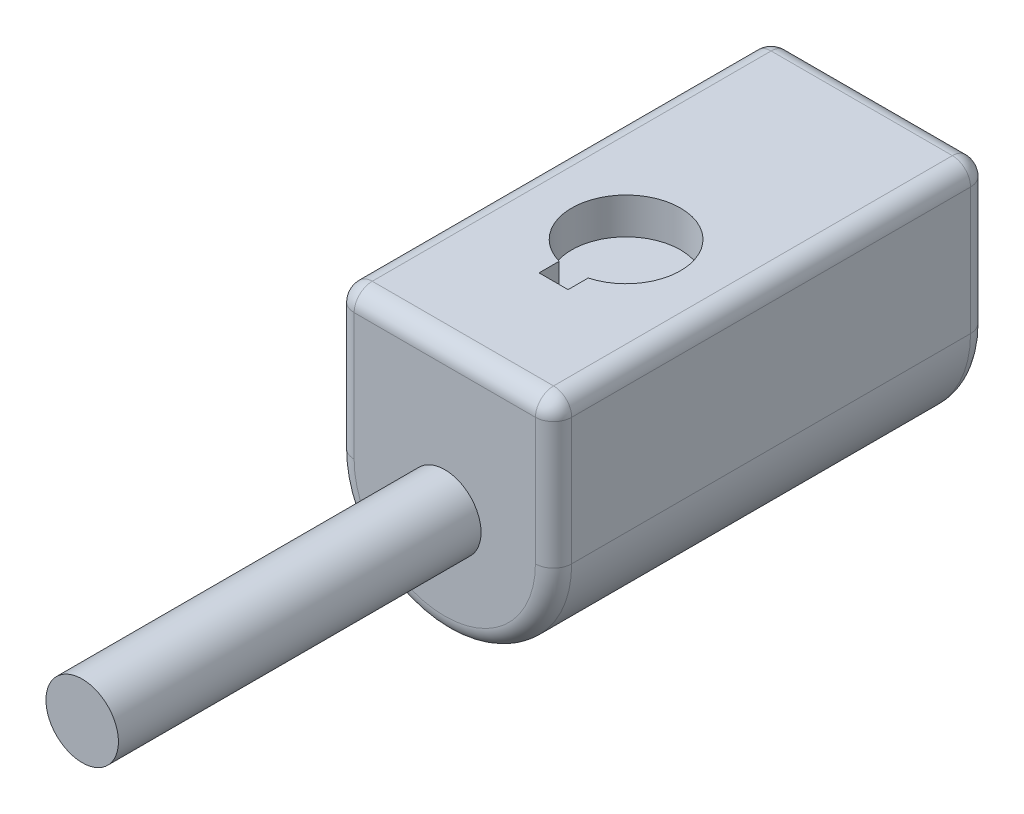
ISO-10303-21;
HEADER;
FILE_DESCRIPTION(('STEP AP214'),'2;1');
FILE_NAME('part.step','',(''),(''),'','','');
FILE_SCHEMA(('AUTOMOTIVE_DESIGN { 1 0 10303 214 1 1 1 1 }'));
ENDSEC;
DATA;
#1=APPLICATION_CONTEXT('core data for automotive mechanical design processes');
#2=APPLICATION_PROTOCOL_DEFINITION('international standard','automotive_design',2000,#1);
#3=PRODUCT_CONTEXT('',#1,'mechanical');
#4=PRODUCT('Part','Part','',(#3));
#5=PRODUCT_RELATED_PRODUCT_CATEGORY('part','',(#4));
#6=PRODUCT_DEFINITION_FORMATION('','',#4);
#7=PRODUCT_DEFINITION_CONTEXT('part definition',#1,'design');
#8=PRODUCT_DEFINITION('design','',#6,#7);
#9=PRODUCT_DEFINITION_SHAPE('','',#8);
#10=(LENGTH_UNIT() NAMED_UNIT(*) SI_UNIT(.MILLI.,.METRE.));
#11=(NAMED_UNIT(*) PLANE_ANGLE_UNIT() SI_UNIT($,.RADIAN.));
#12=(NAMED_UNIT(*) SI_UNIT($,.STERADIAN.) SOLID_ANGLE_UNIT());
#13=UNCERTAINTY_MEASURE_WITH_UNIT(LENGTH_MEASURE(1.E-05),#10,'distance_accuracy_value','');
#14=(GEOMETRIC_REPRESENTATION_CONTEXT(3) GLOBAL_UNCERTAINTY_ASSIGNED_CONTEXT((#13)) GLOBAL_UNIT_ASSIGNED_CONTEXT((#10,
#11,#12)) REPRESENTATION_CONTEXT('',''));
#15=CARTESIAN_POINT('',(0.,0.,0.));
#16=DIRECTION('',(0.,0.,1.));
#17=DIRECTION('',(1.,0.,0.));
#18=AXIS2_PLACEMENT_3D('',#15,#16,#17);
#19=CARTESIAN_POINT('',(0.,0.,0.));
#20=DIRECTION('',(0.,0.,1.));
#21=DIRECTION('',(1.,0.,0.));
#22=AXIS2_PLACEMENT_3D('',#19,#20,#21);
#23=PLANE('',#22);
#24=DIRECTION('',(-1.,0.,0.));
#25=VECTOR('',#24,1.);
#26=CARTESIAN_POINT('',(0.,44.45,0.));
#27=LINE('',#26,#25);
#28=CARTESIAN_POINT('',(31.75,44.45,0.));
#29=VERTEX_POINT('',#28);
#30=CARTESIAN_POINT('',(-31.75,44.45,0.));
#31=VERTEX_POINT('',#30);
#32=EDGE_CURVE('E191',#29,#31,#27,.T.);
#33=ORIENTED_EDGE('',*,*,#32,.T.);
#34=DIRECTION('',(0.,-1.,0.));
#35=VECTOR('',#34,1.);
#36=CARTESIAN_POINT('',(-31.75,0.,0.));
#37=LINE('',#36,#35);
#38=CARTESIAN_POINT('',(-31.75,0.,0.));
#39=VERTEX_POINT('',#38);
#40=EDGE_CURVE('E195',#31,#39,#37,.T.);
#41=ORIENTED_EDGE('',*,*,#40,.T.);
#42=CARTESIAN_POINT('',(0.,0.,0.));
#43=DIRECTION('',(0.,0.,1.));
#44=DIRECTION('',(1.,0.,0.));
#45=AXIS2_PLACEMENT_3D('',#42,#43,#44);
#46=CIRCLE('',#45,31.75);
#47=CARTESIAN_POINT('',(31.75,0.,0.));
#48=VERTEX_POINT('',#47);
#49=EDGE_CURVE('E193',#39,#48,#46,.T.);
#50=ORIENTED_EDGE('',*,*,#49,.T.);
#51=DIRECTION('',(0.,1.,0.));
#52=VECTOR('',#51,1.);
#53=CARTESIAN_POINT('',(31.75,0.,0.));
#54=LINE('',#53,#52);
#55=EDGE_CURVE('E187',#48,#29,#54,.T.);
#56=ORIENTED_EDGE('',*,*,#55,.T.);
#57=EDGE_LOOP('',(#33,#41,#50,#56));
#58=FACE_BOUND('',#57,.T.);
#59=CARTESIAN_POINT('',(0.,0.,0.));
#60=DIRECTION('',(0.,0.,1.));
#61=DIRECTION('',(1.,0.,0.));
#62=AXIS2_PLACEMENT_3D('',#59,#60,#61);
#63=CIRCLE('',#62,12.7);
#64=CARTESIAN_POINT('',(12.7,0.,0.));
#65=VERTEX_POINT('',#64);
#66=EDGE_CURVE('E174',#65,#65,#63,.T.);
#67=ORIENTED_EDGE('',*,*,#66,.F.);
#68=EDGE_LOOP('',(#67));
#69=FACE_BOUND('',#68,.T.);
#70=ADVANCED_FACE('F34',(#58,#69),#23,.T.);
#71=CARTESIAN_POINT('',(0.,0.,-152.4));
#72=DIRECTION('',(0.,0.,1.));
#73=DIRECTION('',(1.,0.,0.));
#74=AXIS2_PLACEMENT_3D('',#71,#72,#73);
#75=CYLINDRICAL_SURFACE('',#74,38.1);
#76=DIRECTION('',(0.,0.,1.));
#77=VECTOR('',#76,1.);
#78=CARTESIAN_POINT('',(38.1,0.,-152.4));
#79=LINE('',#78,#77);
#80=CARTESIAN_POINT('',(38.1,0.,-146.05));
#81=VERTEX_POINT('',#80);
#82=CARTESIAN_POINT('',(38.1,0.,-6.35000000000005));
#83=VERTEX_POINT('',#82);
#84=EDGE_CURVE('E181',#81,#83,#79,.T.);
#85=ORIENTED_EDGE('',*,*,#84,.T.);
#86=CARTESIAN_POINT('',(0.,0.,-6.34999999999999));
#87=DIRECTION('',(0.,0.,1.));
#88=DIRECTION('',(1.,0.,0.));
#89=AXIS2_PLACEMENT_3D('',#86,#87,#88);
#90=CIRCLE('',#89,38.1);
#91=CARTESIAN_POINT('',(-38.1,0.,-6.35000000000005));
#92=VERTEX_POINT('',#91);
#93=EDGE_CURVE('E207',#83,#92,#90,.F.);
#94=ORIENTED_EDGE('',*,*,#93,.T.);
#95=DIRECTION('',(0.,0.,1.));
#96=VECTOR('',#95,1.);
#97=CARTESIAN_POINT('',(-38.1,0.,-152.4));
#98=LINE('',#97,#96);
#99=CARTESIAN_POINT('',(-38.1,0.,-146.05));
#100=VERTEX_POINT('',#99);
#101=EDGE_CURVE('E184',#100,#92,#98,.T.);
#102=ORIENTED_EDGE('',*,*,#101,.F.);
#103=CARTESIAN_POINT('',(0.,0.,-146.05));
#104=DIRECTION('',(0.,0.,1.));
#105=DIRECTION('',(1.,0.,0.));
#106=AXIS2_PLACEMENT_3D('',#103,#104,#105);
#107=CIRCLE('',#106,38.1);
#108=EDGE_CURVE('E205',#100,#81,#107,.T.);
#109=ORIENTED_EDGE('',*,*,#108,.T.);
#110=EDGE_LOOP('',(#85,#94,#102,#109));
#111=FACE_BOUND('',#110,.T.);
#112=ADVANCED_FACE('F298',(#111),#75,.T.);
#113=CARTESIAN_POINT('',(-38.1,0.,-152.4));
#114=DIRECTION('',(-1.,0.,0.));
#115=DIRECTION('',(0.,0.,1.));
#116=AXIS2_PLACEMENT_3D('',#113,#114,#115);
#117=PLANE('',#116);
#118=ORIENTED_EDGE('',*,*,#101,.T.);
#119=DIRECTION('',(0.,-1.,0.));
#120=VECTOR('',#119,1.);
#121=CARTESIAN_POINT('',(-38.1,0.,-6.34999999999999));
#122=LINE('',#121,#120);
#123=CARTESIAN_POINT('',(-38.1,44.45,-6.35));
#124=VERTEX_POINT('',#123);
#125=EDGE_CURVE('E202',#92,#124,#122,.F.);
#126=ORIENTED_EDGE('',*,*,#125,.T.);
#127=DIRECTION('',(0.,0.,1.));
#128=VECTOR('',#127,1.);
#129=CARTESIAN_POINT('',(-38.1,44.45,-152.4));
#130=LINE('',#129,#128);
#131=CARTESIAN_POINT('',(-38.1,44.45,-146.05));
#132=VERTEX_POINT('',#131);
#133=EDGE_CURVE('E198',#124,#132,#130,.F.);
#134=ORIENTED_EDGE('',*,*,#133,.T.);
#135=DIRECTION('',(0.,-1.,0.));
#136=VECTOR('',#135,1.);
#137=CARTESIAN_POINT('',(-38.1,0.,-146.05));
#138=LINE('',#137,#136);
#139=EDGE_CURVE('E200',#132,#100,#138,.T.);
#140=ORIENTED_EDGE('',*,*,#139,.T.);
#141=EDGE_LOOP('',(#118,#126,#134,#140));
#142=FACE_BOUND('',#141,.T.);
#143=ADVANCED_FACE('F302',(#142),#117,.T.);
#144=CARTESIAN_POINT('',(-38.1,50.8,-152.4));
#145=DIRECTION('',(0.,1.,0.));
#146=DIRECTION('',(0.,0.,1.));
#147=AXIS2_PLACEMENT_3D('',#144,#145,#146);
#148=PLANE('',#147);
#149=DIRECTION('',(-1.,0.,0.));
#150=VECTOR('',#149,1.);
#151=CARTESIAN_POINT('',(-38.1,50.8,-146.05));
#152=LINE('',#151,#150);
#153=CARTESIAN_POINT('',(31.75,50.8,-146.05));
#154=VERTEX_POINT('',#153);
#155=CARTESIAN_POINT('',(-31.75,50.8,-146.05));
#156=VERTEX_POINT('',#155);
#157=EDGE_CURVE('E222',#154,#156,#152,.T.);
#158=ORIENTED_EDGE('',*,*,#157,.T.);
#159=DIRECTION('',(0.,0.,1.));
#160=VECTOR('',#159,1.);
#161=CARTESIAN_POINT('',(-31.75,50.8,-152.4));
#162=LINE('',#161,#160);
#163=CARTESIAN_POINT('',(-31.75,50.8,-6.35));
#164=VERTEX_POINT('',#163);
#165=EDGE_CURVE('E224',#156,#164,#162,.T.);
#166=ORIENTED_EDGE('',*,*,#165,.T.);
#167=DIRECTION('',(-1.,0.,0.));
#168=VECTOR('',#167,1.);
#169=CARTESIAN_POINT('',(-38.1,50.8,-6.34999999999999));
#170=LINE('',#169,#168);
#171=CARTESIAN_POINT('',(31.75,50.8,-6.35));
#172=VERTEX_POINT('',#171);
#173=EDGE_CURVE('E218',#164,#172,#170,.F.);
#174=ORIENTED_EDGE('',*,*,#173,.T.);
#175=DIRECTION('',(0.,0.,1.));
#176=VECTOR('',#175,1.);
#177=CARTESIAN_POINT('',(31.75,50.8,-152.4));
#178=LINE('',#177,#176);
#179=EDGE_CURVE('E220',#172,#154,#178,.F.);
#180=ORIENTED_EDGE('',*,*,#179,.T.);
#181=EDGE_LOOP('',(#158,#166,#174,#180));
#182=FACE_BOUND('',#181,.T.);
#183=DIRECTION('',(0.,0.,1.));
#184=VECTOR('',#183,1.);
#185=CARTESIAN_POINT('',(-5.08000000000001,50.8,-45.1398229856028));
#186=LINE('',#185,#184);
#187=CARTESIAN_POINT('',(-5.08,50.8,-45.1398229856028));
#188=VERTEX_POINT('',#187);
#189=CARTESIAN_POINT('',(-5.08000000000001,50.8,-38.1));
#190=VERTEX_POINT('',#189);
#191=EDGE_CURVE('E142',#188,#190,#186,.T.);
#192=ORIENTED_EDGE('',*,*,#191,.F.);
#193=CARTESIAN_POINT('',(0.,50.8,-63.5));
#194=DIRECTION('',(0.,1.,0.));
#195=DIRECTION('',(0.,0.,1.));
#196=AXIS2_PLACEMENT_3D('',#193,#194,#195);
#197=CIRCLE('',#196,19.05);
#198=CARTESIAN_POINT('',(5.07999999999999,50.8,-45.1398229856028));
#199=VERTEX_POINT('',#198);
#200=EDGE_CURVE('E159',#199,#188,#197,.T.);
#201=ORIENTED_EDGE('',*,*,#200,.F.);
#202=DIRECTION('',(0.,0.,-1.));
#203=VECTOR('',#202,1.);
#204=CARTESIAN_POINT('',(5.07999999999999,50.8,-45.1398229856028));
#205=LINE('',#204,#203);
#206=CARTESIAN_POINT('',(5.08,50.8,-38.1));
#207=VERTEX_POINT('',#206);
#208=EDGE_CURVE('E162',#207,#199,#205,.T.);
#209=ORIENTED_EDGE('',*,*,#208,.F.);
#210=DIRECTION('',(1.,0.,0.));
#211=VECTOR('',#210,1.);
#212=CARTESIAN_POINT('',(5.08,50.8,-38.1));
#213=LINE('',#212,#211);
#214=EDGE_CURVE('E168',#190,#207,#213,.T.);
#215=ORIENTED_EDGE('',*,*,#214,.F.);
#216=EDGE_LOOP('',(#192,#201,#209,#215));
#217=FACE_BOUND('',#216,.T.);
#218=ADVANCED_FACE('F348',(#182,#217),#148,.T.);
#219=CARTESIAN_POINT('',(38.1,0.,-152.4));
#220=DIRECTION('',(1.,0.,0.));
#221=DIRECTION('',(0.,0.,-1.));
#222=AXIS2_PLACEMENT_3D('',#219,#220,#221);
#223=PLANE('',#222);
#224=DIRECTION('',(0.,0.,1.));
#225=VECTOR('',#224,1.);
#226=CARTESIAN_POINT('',(38.1,44.45,-152.4));
#227=LINE('',#226,#225);
#228=CARTESIAN_POINT('',(38.1,44.45,-146.05));
#229=VERTEX_POINT('',#228);
#230=CARTESIAN_POINT('',(38.1,44.45,-6.35));
#231=VERTEX_POINT('',#230);
#232=EDGE_CURVE('E43',#229,#231,#227,.T.);
#233=ORIENTED_EDGE('',*,*,#232,.T.);
#234=DIRECTION('',(0.,1.,0.));
#235=VECTOR('',#234,1.);
#236=CARTESIAN_POINT('',(38.1,0.,-6.34999999999999));
#237=LINE('',#236,#235);
#238=EDGE_CURVE('E11',#231,#83,#237,.F.);
#239=ORIENTED_EDGE('',*,*,#238,.T.);
#240=ORIENTED_EDGE('',*,*,#84,.F.);
#241=DIRECTION('',(0.,1.,0.));
#242=VECTOR('',#241,1.);
#243=CARTESIAN_POINT('',(38.1,50.8,-146.05));
#244=LINE('',#243,#242);
#245=EDGE_CURVE('E54',#81,#229,#244,.T.);
#246=ORIENTED_EDGE('',*,*,#245,.T.);
#247=EDGE_LOOP('',(#233,#239,#240,#246));
#248=FACE_BOUND('',#247,.T.);
#249=ADVANCED_FACE('F296',(#248),#223,.T.);
#250=CARTESIAN_POINT('',(0.,0.,-152.4));
#251=DIRECTION('',(0.,0.,1.));
#252=DIRECTION('',(1.,0.,0.));
#253=AXIS2_PLACEMENT_3D('',#250,#251,#252);
#254=PLANE('',#253);
#255=CARTESIAN_POINT('',(0.,0.,-152.4));
#256=DIRECTION('',(0.,0.,1.));
#257=DIRECTION('',(1.,0.,0.));
#258=AXIS2_PLACEMENT_3D('',#255,#256,#257);
#259=CIRCLE('',#258,31.75);
#260=CARTESIAN_POINT('',(31.75,0.,-152.4));
#261=VERTEX_POINT('',#260);
#262=CARTESIAN_POINT('',(-31.75,0.,-152.4));
#263=VERTEX_POINT('',#262);
#264=EDGE_CURVE('E213',#261,#263,#259,.F.);
#265=ORIENTED_EDGE('',*,*,#264,.T.);
#266=DIRECTION('',(0.,-1.,0.));
#267=VECTOR('',#266,1.);
#268=CARTESIAN_POINT('',(-31.75,50.8,-152.4));
#269=LINE('',#268,#267);
#270=CARTESIAN_POINT('',(-31.75,44.45,-152.4));
#271=VERTEX_POINT('',#270);
#272=EDGE_CURVE('E215',#263,#271,#269,.F.);
#273=ORIENTED_EDGE('',*,*,#272,.T.);
#274=DIRECTION('',(-1.,0.,0.));
#275=VECTOR('',#274,1.);
#276=CARTESIAN_POINT('',(38.1,44.45,-152.4));
#277=LINE('',#276,#275);
#278=CARTESIAN_POINT('',(31.75,44.45,-152.4));
#279=VERTEX_POINT('',#278);
#280=EDGE_CURVE('E211',#271,#279,#277,.F.);
#281=ORIENTED_EDGE('',*,*,#280,.T.);
#282=DIRECTION('',(0.,1.,0.));
#283=VECTOR('',#282,1.);
#284=CARTESIAN_POINT('',(31.75,0.,-152.4));
#285=LINE('',#284,#283);
#286=EDGE_CURVE('E209',#279,#261,#285,.F.);
#287=ORIENTED_EDGE('',*,*,#286,.T.);
#288=EDGE_LOOP('',(#265,#273,#281,#287));
#289=FACE_BOUND('',#288,.T.);
#290=ADVANCED_FACE('F337',(#289),#254,.F.);
#291=CARTESIAN_POINT('',(0.,0.,127.));
#292=DIRECTION('',(0.,0.,-1.));
#293=DIRECTION('',(-1.,0.,0.));
#294=AXIS2_PLACEMENT_3D('',#291,#292,#293);
#295=CYLINDRICAL_SURFACE('',#294,12.7);
#296=CARTESIAN_POINT('',(0.,0.,127.));
#297=DIRECTION('',(0.,0.,1.));
#298=DIRECTION('',(1.,0.,0.));
#299=AXIS2_PLACEMENT_3D('',#296,#297,#298);
#300=CIRCLE('',#299,12.7);
#301=CARTESIAN_POINT('',(12.7,0.,127.));
#302=VERTEX_POINT('',#301);
#303=EDGE_CURVE('E178',#302,#302,#300,.T.);
#304=ORIENTED_EDGE('',*,*,#303,.F.);
#305=EDGE_LOOP('',(#304));
#306=FACE_BOUND('',#305,.T.);
#307=ORIENTED_EDGE('',*,*,#66,.T.);
#308=EDGE_LOOP('',(#307));
#309=FACE_BOUND('',#308,.T.);
#310=ADVANCED_FACE('F339',(#306,#309),#295,.T.);
#311=CARTESIAN_POINT('',(0.,0.,127.));
#312=DIRECTION('',(0.,0.,1.));
#313=DIRECTION('',(1.,0.,0.));
#314=AXIS2_PLACEMENT_3D('',#311,#312,#313);
#315=PLANE('',#314);
#316=ORIENTED_EDGE('',*,*,#303,.T.);
#317=EDGE_LOOP('',(#316));
#318=FACE_BOUND('',#317,.T.);
#319=ADVANCED_FACE('F345',(#318),#315,.T.);
#320=CARTESIAN_POINT('',(-5.08000000000001,38.1,-45.1398229856028));
#321=DIRECTION('',(-1.,0.,0.));
#322=DIRECTION('',(0.,0.,1.));
#323=AXIS2_PLACEMENT_3D('',#320,#321,#322);
#324=PLANE('',#323);
#325=ORIENTED_EDGE('',*,*,#191,.T.);
#326=DIRECTION('',(0.,1.,0.));
#327=VECTOR('',#326,1.);
#328=CARTESIAN_POINT('',(-5.08000000000001,38.1,-38.1));
#329=LINE('',#328,#327);
#330=CARTESIAN_POINT('',(-5.08000000000001,38.1,-38.1));
#331=VERTEX_POINT('',#330);
#332=EDGE_CURVE('E135',#331,#190,#329,.T.);
#333=ORIENTED_EDGE('',*,*,#332,.F.);
#334=DIRECTION('',(0.,0.,1.));
#335=VECTOR('',#334,1.);
#336=CARTESIAN_POINT('',(-5.08000000000001,38.1,-45.1398229856028));
#337=LINE('',#336,#335);
#338=CARTESIAN_POINT('',(-5.08,38.1,-45.1398229856028));
#339=VERTEX_POINT('',#338);
#340=EDGE_CURVE('E139',#339,#331,#337,.T.);
#341=ORIENTED_EDGE('',*,*,#340,.F.);
#342=DIRECTION('',(0.,1.,0.));
#343=VECTOR('',#342,1.);
#344=CARTESIAN_POINT('',(-5.08,38.1,-45.1398229856028));
#345=LINE('',#344,#343);
#346=EDGE_CURVE('E172',#339,#188,#345,.T.);
#347=ORIENTED_EDGE('',*,*,#346,.T.);
#348=EDGE_LOOP('',(#325,#333,#341,#347));
#349=FACE_BOUND('',#348,.T.);
#350=ADVANCED_FACE('F137',(#349),#324,.F.);
#351=CARTESIAN_POINT('',(0.,38.1,-63.5));
#352=DIRECTION('',(0.,1.,0.));
#353=DIRECTION('',(0.,0.,1.));
#354=AXIS2_PLACEMENT_3D('',#351,#352,#353);
#355=CYLINDRICAL_SURFACE('',#354,19.05);
#356=ORIENTED_EDGE('',*,*,#200,.T.);
#357=ORIENTED_EDGE('',*,*,#346,.F.);
#358=CARTESIAN_POINT('',(0.,38.1,-63.5));
#359=DIRECTION('',(0.,1.,0.));
#360=DIRECTION('',(0.,0.,1.));
#361=AXIS2_PLACEMENT_3D('',#358,#359,#360);
#362=CIRCLE('',#361,19.05);
#363=CARTESIAN_POINT('',(5.07999999999999,38.1,-45.1398229856028));
#364=VERTEX_POINT('',#363);
#365=EDGE_CURVE('E147',#364,#339,#362,.T.);
#366=ORIENTED_EDGE('',*,*,#365,.F.);
#367=DIRECTION('',(0.,1.,0.));
#368=VECTOR('',#367,1.);
#369=CARTESIAN_POINT('',(5.07999999999999,38.1,-45.1398229856028));
#370=LINE('',#369,#368);
#371=EDGE_CURVE('E175',#364,#199,#370,.T.);
#372=ORIENTED_EDGE('',*,*,#371,.T.);
#373=EDGE_LOOP('',(#356,#357,#366,#372));
#374=FACE_BOUND('',#373,.T.);
#375=ADVANCED_FACE('F399',(#374),#355,.F.);
#376=CARTESIAN_POINT('',(5.07999999999999,38.1,-45.1398229856028));
#377=DIRECTION('',(1.,0.,0.));
#378=DIRECTION('',(0.,0.,-1.));
#379=AXIS2_PLACEMENT_3D('',#376,#377,#378);
#380=PLANE('',#379);
#381=ORIENTED_EDGE('',*,*,#208,.T.);
#382=ORIENTED_EDGE('',*,*,#371,.F.);
#383=DIRECTION('',(0.,0.,-1.));
#384=VECTOR('',#383,1.);
#385=CARTESIAN_POINT('',(5.07999999999999,38.1,-45.1398229856028));
#386=LINE('',#385,#384);
#387=CARTESIAN_POINT('',(5.08,38.1,-38.1));
#388=VERTEX_POINT('',#387);
#389=EDGE_CURVE('E155',#388,#364,#386,.T.);
#390=ORIENTED_EDGE('',*,*,#389,.F.);
#391=DIRECTION('',(0.,1.,0.));
#392=VECTOR('',#391,1.);
#393=CARTESIAN_POINT('',(5.08,38.1,-38.1));
#394=LINE('',#393,#392);
#395=EDGE_CURVE('E146',#388,#207,#394,.T.);
#396=ORIENTED_EDGE('',*,*,#395,.T.);
#397=EDGE_LOOP('',(#381,#382,#390,#396));
#398=FACE_BOUND('',#397,.T.);
#399=ADVANCED_FACE('F396',(#398),#380,.F.);
#400=CARTESIAN_POINT('',(5.08,38.1,-38.1));
#401=DIRECTION('',(0.,0.,1.));
#402=DIRECTION('',(1.,0.,0.));
#403=AXIS2_PLACEMENT_3D('',#400,#401,#402);
#404=PLANE('',#403);
#405=ORIENTED_EDGE('',*,*,#214,.T.);
#406=ORIENTED_EDGE('',*,*,#395,.F.);
#407=DIRECTION('',(1.,0.,0.));
#408=VECTOR('',#407,1.);
#409=CARTESIAN_POINT('',(5.08,38.1,-38.1));
#410=LINE('',#409,#408);
#411=EDGE_CURVE('E150',#331,#388,#410,.T.);
#412=ORIENTED_EDGE('',*,*,#411,.F.);
#413=ORIENTED_EDGE('',*,*,#332,.T.);
#414=EDGE_LOOP('',(#405,#406,#412,#413));
#415=FACE_BOUND('',#414,.T.);
#416=ADVANCED_FACE('F151',(#415),#404,.F.);
#417=CARTESIAN_POINT('',(0.,38.1,-63.5));
#418=DIRECTION('',(0.,1.,0.));
#419=DIRECTION('',(0.,0.,1.));
#420=AXIS2_PLACEMENT_3D('',#417,#418,#419);
#421=PLANE('',#420);
#422=ORIENTED_EDGE('',*,*,#340,.T.);
#423=ORIENTED_EDGE('',*,*,#411,.T.);
#424=ORIENTED_EDGE('',*,*,#389,.T.);
#425=ORIENTED_EDGE('',*,*,#365,.T.);
#426=EDGE_LOOP('',(#422,#423,#424,#425));
#427=FACE_BOUND('',#426,.T.);
#428=ADVANCED_FACE('F157',(#427),#421,.T.);
#429=CARTESIAN_POINT('',(31.75,0.,-146.05));
#430=DIRECTION('',(0.,-1.,0.));
#431=DIRECTION('',(0.,0.,-1.));
#432=AXIS2_PLACEMENT_3D('',#429,#430,#431);
#433=CYLINDRICAL_SURFACE('',#432,6.35);
#434=CARTESIAN_POINT('',(31.75,44.45,-146.05));
#435=DIRECTION('',(0.,1.,0.));
#436=DIRECTION('',(0.,0.,1.));
#437=AXIS2_PLACEMENT_3D('',#434,#435,#436);
#438=CIRCLE('',#437,6.35);
#439=EDGE_CURVE('E266',#229,#279,#438,.T.);
#440=ORIENTED_EDGE('',*,*,#439,.F.);
#441=ORIENTED_EDGE('',*,*,#245,.F.);
#442=CARTESIAN_POINT('',(31.75,0.,-146.05));
#443=DIRECTION('',(0.,-1.,0.));
#444=DIRECTION('',(0.,0.,-1.));
#445=AXIS2_PLACEMENT_3D('',#442,#443,#444);
#446=CIRCLE('',#445,6.35);
#447=EDGE_CURVE('E38',#261,#81,#446,.T.);
#448=ORIENTED_EDGE('',*,*,#447,.F.);
#449=ORIENTED_EDGE('',*,*,#286,.F.);
#450=EDGE_LOOP('',(#440,#441,#448,#449));
#451=FACE_BOUND('',#450,.T.);
#452=ADVANCED_FACE('F36',(#451),#433,.T.);
#453=CARTESIAN_POINT('',(0.,0.,-146.05));
#454=DIRECTION('',(0.,0.,1.));
#455=DIRECTION('',(1.,0.,0.));
#456=AXIS2_PLACEMENT_3D('',#453,#454,#455);
#457=TOROIDAL_SURFACE('',#456,31.75,6.35);
#458=ORIENTED_EDGE('',*,*,#447,.T.);
#459=ORIENTED_EDGE('',*,*,#108,.F.);
#460=CARTESIAN_POINT('',(-31.75,0.,-146.05));
#461=DIRECTION('',(0.,1.,0.));
#462=DIRECTION('',(0.,0.,1.));
#463=AXIS2_PLACEMENT_3D('',#460,#461,#462);
#464=CIRCLE('',#463,6.35);
#465=EDGE_CURVE('E264',#263,#100,#464,.T.);
#466=ORIENTED_EDGE('',*,*,#465,.F.);
#467=ORIENTED_EDGE('',*,*,#264,.F.);
#468=EDGE_LOOP('',(#458,#459,#466,#467));
#469=FACE_BOUND('',#468,.T.);
#470=ADVANCED_FACE('F276',(#469),#457,.T.);
#471=CARTESIAN_POINT('',(31.75,44.45,-146.05));
#472=DIRECTION('',(0.,0.,1.));
#473=DIRECTION('',(1.,0.,0.));
#474=AXIS2_PLACEMENT_3D('',#471,#472,#473);
#475=SPHERICAL_SURFACE('',#474,6.35);
#476=CARTESIAN_POINT('',(31.75,44.45,-146.05));
#477=DIRECTION('',(0.,0.,-1.));
#478=DIRECTION('',(-1.,0.,0.));
#479=AXIS2_PLACEMENT_3D('',#476,#477,#478);
#480=CIRCLE('',#479,6.35);
#481=EDGE_CURVE('E258',#229,#154,#480,.F.);
#482=ORIENTED_EDGE('',*,*,#481,.F.);
#483=ORIENTED_EDGE('',*,*,#439,.T.);
#484=CARTESIAN_POINT('',(31.75,44.45,-146.05));
#485=DIRECTION('',(1.,0.,0.));
#486=DIRECTION('',(0.,0.,-1.));
#487=AXIS2_PLACEMENT_3D('',#484,#485,#486);
#488=CIRCLE('',#487,6.35);
#489=EDGE_CURVE('E261',#154,#279,#488,.F.);
#490=ORIENTED_EDGE('',*,*,#489,.F.);
#491=EDGE_LOOP('',(#482,#483,#490));
#492=FACE_BOUND('',#491,.T.);
#493=ADVANCED_FACE('F280',(#492),#475,.T.);
#494=CARTESIAN_POINT('',(-31.75,0.,-146.05));
#495=DIRECTION('',(0.,1.,0.));
#496=DIRECTION('',(0.,0.,1.));
#497=AXIS2_PLACEMENT_3D('',#494,#495,#496);
#498=CYLINDRICAL_SURFACE('',#497,6.35);
#499=ORIENTED_EDGE('',*,*,#465,.T.);
#500=ORIENTED_EDGE('',*,*,#139,.F.);
#501=CARTESIAN_POINT('',(-31.75,44.45,-146.05));
#502=DIRECTION('',(0.,1.,0.));
#503=DIRECTION('',(0.,0.,1.));
#504=AXIS2_PLACEMENT_3D('',#501,#502,#503);
#505=CIRCLE('',#504,6.35);
#506=EDGE_CURVE('E255',#271,#132,#505,.T.);
#507=ORIENTED_EDGE('',*,*,#506,.F.);
#508=ORIENTED_EDGE('',*,*,#272,.F.);
#509=EDGE_LOOP('',(#499,#500,#507,#508));
#510=FACE_BOUND('',#509,.T.);
#511=ADVANCED_FACE('F328',(#510),#498,.T.);
#512=CARTESIAN_POINT('',(-38.1,44.45,-146.05));
#513=DIRECTION('',(1.,0.,0.));
#514=DIRECTION('',(0.,0.,-1.));
#515=AXIS2_PLACEMENT_3D('',#512,#513,#514);
#516=CYLINDRICAL_SURFACE('',#515,6.35);
#517=ORIENTED_EDGE('',*,*,#489,.T.);
#518=ORIENTED_EDGE('',*,*,#280,.F.);
#519=CARTESIAN_POINT('',(-31.75,44.45,-146.05));
#520=DIRECTION('',(-1.,0.,0.));
#521=DIRECTION('',(0.,0.,1.));
#522=AXIS2_PLACEMENT_3D('',#519,#520,#521);
#523=CIRCLE('',#522,6.35);
#524=EDGE_CURVE('E253',#156,#271,#523,.T.);
#525=ORIENTED_EDGE('',*,*,#524,.F.);
#526=ORIENTED_EDGE('',*,*,#157,.F.);
#527=EDGE_LOOP('',(#517,#518,#525,#526));
#528=FACE_BOUND('',#527,.T.);
#529=ADVANCED_FACE('F335',(#528),#516,.T.);
#530=CARTESIAN_POINT('',(31.75,44.45,-152.4));
#531=DIRECTION('',(0.,0.,1.));
#532=DIRECTION('',(1.,0.,0.));
#533=AXIS2_PLACEMENT_3D('',#530,#531,#532);
#534=CYLINDRICAL_SURFACE('',#533,6.35);
#535=ORIENTED_EDGE('',*,*,#481,.T.);
#536=ORIENTED_EDGE('',*,*,#179,.F.);
#537=CARTESIAN_POINT('',(31.75,44.45,-6.35));
#538=DIRECTION('',(0.,0.,1.));
#539=DIRECTION('',(1.,0.,0.));
#540=AXIS2_PLACEMENT_3D('',#537,#538,#539);
#541=CIRCLE('',#540,6.35);
#542=EDGE_CURVE('E250',#231,#172,#541,.T.);
#543=ORIENTED_EDGE('',*,*,#542,.F.);
#544=ORIENTED_EDGE('',*,*,#232,.F.);
#545=EDGE_LOOP('',(#535,#536,#543,#544));
#546=FACE_BOUND('',#545,.T.);
#547=ADVANCED_FACE('F284',(#546),#534,.T.);
#548=CARTESIAN_POINT('',(-31.75,44.45,-146.05));
#549=DIRECTION('',(0.,0.,1.));
#550=DIRECTION('',(1.,0.,0.));
#551=AXIS2_PLACEMENT_3D('',#548,#549,#550);
#552=SPHERICAL_SURFACE('',#551,6.35);
#553=ORIENTED_EDGE('',*,*,#524,.T.);
#554=ORIENTED_EDGE('',*,*,#506,.T.);
#555=CARTESIAN_POINT('',(-31.75,44.45,-146.05));
#556=DIRECTION('',(0.,0.,-1.));
#557=DIRECTION('',(-1.,0.,0.));
#558=AXIS2_PLACEMENT_3D('',#555,#556,#557);
#559=CIRCLE('',#558,6.35);
#560=EDGE_CURVE('E247',#156,#132,#559,.F.);
#561=ORIENTED_EDGE('',*,*,#560,.F.);
#562=EDGE_LOOP('',(#553,#554,#561));
#563=FACE_BOUND('',#562,.T.);
#564=ADVANCED_FACE('F332',(#563),#552,.T.);
#565=CARTESIAN_POINT('',(31.75,44.45,-6.35));
#566=DIRECTION('',(0.,0.,1.));
#567=DIRECTION('',(1.,0.,0.));
#568=AXIS2_PLACEMENT_3D('',#565,#566,#567);
#569=SPHERICAL_SURFACE('',#568,6.35);
#570=CARTESIAN_POINT('',(31.75,44.45,-6.35));
#571=DIRECTION('',(0.,1.,0.));
#572=DIRECTION('',(0.,0.,1.));
#573=AXIS2_PLACEMENT_3D('',#570,#571,#572);
#574=CIRCLE('',#573,6.35);
#575=EDGE_CURVE('E241',#231,#29,#574,.F.);
#576=ORIENTED_EDGE('',*,*,#575,.F.);
#577=ORIENTED_EDGE('',*,*,#542,.T.);
#578=CARTESIAN_POINT('',(31.75,44.45,-6.35));
#579=DIRECTION('',(1.,0.,0.));
#580=DIRECTION('',(0.,0.,-1.));
#581=AXIS2_PLACEMENT_3D('',#578,#579,#580);
#582=CIRCLE('',#581,6.35);
#583=EDGE_CURVE('E244',#29,#172,#582,.F.);
#584=ORIENTED_EDGE('',*,*,#583,.F.);
#585=EDGE_LOOP('',(#576,#577,#584));
#586=FACE_BOUND('',#585,.T.);
#587=ADVANCED_FACE('F289',(#586),#569,.T.);
#588=CARTESIAN_POINT('',(-31.75,44.45,-152.4));
#589=DIRECTION('',(0.,0.,1.));
#590=DIRECTION('',(1.,0.,0.));
#591=AXIS2_PLACEMENT_3D('',#588,#589,#590);
#592=CYLINDRICAL_SURFACE('',#591,6.35);
#593=ORIENTED_EDGE('',*,*,#560,.T.);
#594=ORIENTED_EDGE('',*,*,#133,.F.);
#595=CARTESIAN_POINT('',(-31.75,44.45,-6.35));
#596=DIRECTION('',(0.,0.,1.));
#597=DIRECTION('',(1.,0.,0.));
#598=AXIS2_PLACEMENT_3D('',#595,#596,#597);
#599=CIRCLE('',#598,6.35);
#600=EDGE_CURVE('E238',#164,#124,#599,.T.);
#601=ORIENTED_EDGE('',*,*,#600,.F.);
#602=ORIENTED_EDGE('',*,*,#165,.F.);
#603=EDGE_LOOP('',(#593,#594,#601,#602));
#604=FACE_BOUND('',#603,.T.);
#605=ADVANCED_FACE('F324',(#604),#592,.T.);
#606=CARTESIAN_POINT('',(0.,44.45,-6.35));
#607=DIRECTION('',(-1.,0.,0.));
#608=DIRECTION('',(0.,0.,1.));
#609=AXIS2_PLACEMENT_3D('',#606,#607,#608);
#610=CYLINDRICAL_SURFACE('',#609,6.35);
#611=ORIENTED_EDGE('',*,*,#583,.T.);
#612=ORIENTED_EDGE('',*,*,#173,.F.);
#613=CARTESIAN_POINT('',(-31.75,44.45,-6.35));
#614=DIRECTION('',(-1.,0.,0.));
#615=DIRECTION('',(0.,0.,1.));
#616=AXIS2_PLACEMENT_3D('',#613,#614,#615);
#617=CIRCLE('',#616,6.35);
#618=EDGE_CURVE('E236',#31,#164,#617,.T.);
#619=ORIENTED_EDGE('',*,*,#618,.F.);
#620=ORIENTED_EDGE('',*,*,#32,.F.);
#621=EDGE_LOOP('',(#611,#612,#619,#620));
#622=FACE_BOUND('',#621,.T.);
#623=ADVANCED_FACE('F317',(#622),#610,.T.);
#624=CARTESIAN_POINT('',(31.75,0.,-6.35));
#625=DIRECTION('',(0.,1.,0.));
#626=DIRECTION('',(0.,0.,1.));
#627=AXIS2_PLACEMENT_3D('',#624,#625,#626);
#628=CYLINDRICAL_SURFACE('',#627,6.35);
#629=ORIENTED_EDGE('',*,*,#575,.T.);
#630=ORIENTED_EDGE('',*,*,#55,.F.);
#631=CARTESIAN_POINT('',(31.75,0.,-6.35));
#632=DIRECTION('',(0.,-1.,0.));
#633=DIRECTION('',(0.,0.,-1.));
#634=AXIS2_PLACEMENT_3D('',#631,#632,#633);
#635=CIRCLE('',#634,6.35);
#636=EDGE_CURVE('E233',#83,#48,#635,.T.);
#637=ORIENTED_EDGE('',*,*,#636,.F.);
#638=ORIENTED_EDGE('',*,*,#238,.F.);
#639=EDGE_LOOP('',(#629,#630,#637,#638));
#640=FACE_BOUND('',#639,.T.);
#641=ADVANCED_FACE('F294',(#640),#628,.T.);
#642=CARTESIAN_POINT('',(-31.75,44.45,-6.35));
#643=DIRECTION('',(0.,0.,1.));
#644=DIRECTION('',(1.,0.,0.));
#645=AXIS2_PLACEMENT_3D('',#642,#643,#644);
#646=SPHERICAL_SURFACE('',#645,6.35);
#647=ORIENTED_EDGE('',*,*,#618,.T.);
#648=ORIENTED_EDGE('',*,*,#600,.T.);
#649=CARTESIAN_POINT('',(-31.75,44.45,-6.35));
#650=DIRECTION('',(0.,1.,0.));
#651=DIRECTION('',(0.,0.,1.));
#652=AXIS2_PLACEMENT_3D('',#649,#650,#651);
#653=CIRCLE('',#652,6.35);
#654=EDGE_CURVE('E231',#31,#124,#653,.F.);
#655=ORIENTED_EDGE('',*,*,#654,.F.);
#656=EDGE_LOOP('',(#647,#648,#655));
#657=FACE_BOUND('',#656,.T.);
#658=ADVANCED_FACE('F320',(#657),#646,.T.);
#659=CARTESIAN_POINT('',(0.,0.,-6.34999999999999));
#660=DIRECTION('',(0.,0.,1.));
#661=DIRECTION('',(1.,0.,0.));
#662=AXIS2_PLACEMENT_3D('',#659,#660,#661);
#663=TOROIDAL_SURFACE('',#662,31.75,6.35);
#664=ORIENTED_EDGE('',*,*,#636,.T.);
#665=ORIENTED_EDGE('',*,*,#49,.F.);
#666=CARTESIAN_POINT('',(-31.75,0.,-6.34999999999999));
#667=DIRECTION('',(0.,1.,0.));
#668=DIRECTION('',(0.,0.,1.));
#669=AXIS2_PLACEMENT_3D('',#666,#667,#668);
#670=CIRCLE('',#669,6.35);
#671=EDGE_CURVE('E229',#92,#39,#670,.T.);
#672=ORIENTED_EDGE('',*,*,#671,.F.);
#673=ORIENTED_EDGE('',*,*,#93,.F.);
#674=EDGE_LOOP('',(#664,#665,#672,#673));
#675=FACE_BOUND('',#674,.T.);
#676=ADVANCED_FACE('F311',(#675),#663,.T.);
#677=CARTESIAN_POINT('',(-31.75,0.,-6.35));
#678=DIRECTION('',(0.,-1.,0.));
#679=DIRECTION('',(0.,0.,-1.));
#680=AXIS2_PLACEMENT_3D('',#677,#678,#679);
#681=CYLINDRICAL_SURFACE('',#680,6.35);
#682=ORIENTED_EDGE('',*,*,#654,.T.);
#683=ORIENTED_EDGE('',*,*,#125,.F.);
#684=ORIENTED_EDGE('',*,*,#671,.T.);
#685=ORIENTED_EDGE('',*,*,#40,.F.);
#686=EDGE_LOOP('',(#682,#683,#684,#685));
#687=FACE_BOUND('',#686,.T.);
#688=ADVANCED_FACE('F306',(#687),#681,.T.);
#689=CLOSED_SHELL('',(#70,#112,#143,#218,#249,#290,#310,#319,#350,#375,#399,#416,#428,#452,#470,
#493,#511,#529,#547,#564,#587,#605,#623,#641,#658,#676,#688));
#690=MANIFOLD_SOLID_BREP('B2',#689);
#691=ADVANCED_BREP_SHAPE_REPRESENTATION('',(#18,#690),#14);
#692=SHAPE_DEFINITION_REPRESENTATION(#9,#691);
ENDSEC;
END-ISO-10303-21;
